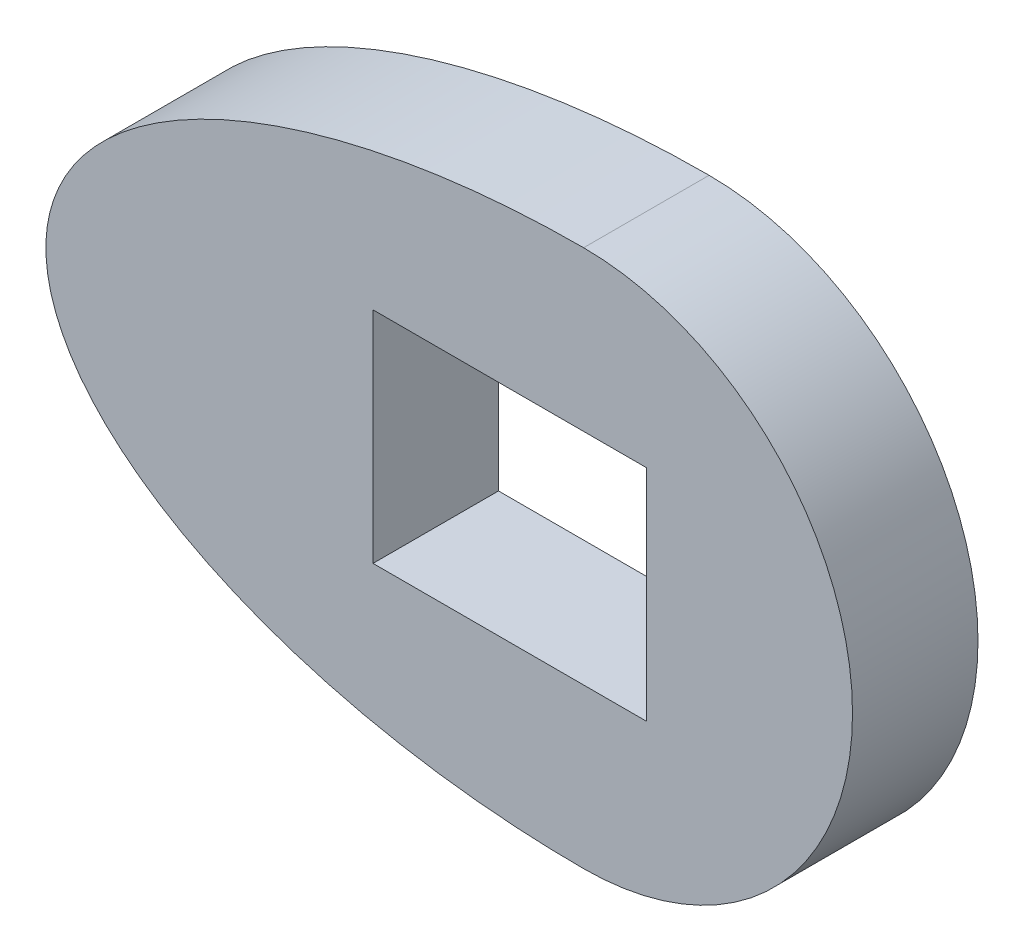
ISO-10303-21;
HEADER;
FILE_DESCRIPTION(('STEP AP214'),'2;1');
FILE_NAME('part.step','',(''),(''),'','','');
FILE_SCHEMA(('AUTOMOTIVE_DESIGN { 1 0 10303 214 1 1 1 1 }'));
ENDSEC;
DATA;
#1=APPLICATION_CONTEXT('core data for automotive mechanical design processes');
#2=APPLICATION_PROTOCOL_DEFINITION('international standard','automotive_design',2000,#1);
#3=PRODUCT_CONTEXT('',#1,'mechanical');
#4=PRODUCT('Part','Part','',(#3));
#5=PRODUCT_RELATED_PRODUCT_CATEGORY('part','',(#4));
#6=PRODUCT_DEFINITION_FORMATION('','',#4);
#7=PRODUCT_DEFINITION_CONTEXT('part definition',#1,'design');
#8=PRODUCT_DEFINITION('design','',#6,#7);
#9=PRODUCT_DEFINITION_SHAPE('','',#8);
#10=(LENGTH_UNIT() NAMED_UNIT(*) SI_UNIT(.MILLI.,.METRE.));
#11=(NAMED_UNIT(*) PLANE_ANGLE_UNIT() SI_UNIT($,.RADIAN.));
#12=(NAMED_UNIT(*) SI_UNIT($,.STERADIAN.) SOLID_ANGLE_UNIT());
#13=UNCERTAINTY_MEASURE_WITH_UNIT(LENGTH_MEASURE(1.E-05),#10,'distance_accuracy_value','');
#14=(GEOMETRIC_REPRESENTATION_CONTEXT(3) GLOBAL_UNCERTAINTY_ASSIGNED_CONTEXT((#13)) GLOBAL_UNIT_ASSIGNED_CONTEXT((#10,
#11,#12)) REPRESENTATION_CONTEXT('',''));
#15=CARTESIAN_POINT('',(0.,0.,0.));
#16=DIRECTION('',(0.,0.,1.));
#17=DIRECTION('',(1.,0.,0.));
#18=AXIS2_PLACEMENT_3D('',#15,#16,#17);
#19=CARTESIAN_POINT('',(0.,0.,14.));
#20=DIRECTION('',(0.,0.,1.));
#21=DIRECTION('',(1.,0.,0.));
#22=AXIS2_PLACEMENT_3D('',#19,#20,#21);
#23=ELLIPSE('',#22,60.,30.);
#24=DIRECTION('',(0.,0.,-1.));
#25=VECTOR('',#24,1.);
#26=SURFACE_OF_LINEAR_EXTRUSION('',#23,#25);
#27=CARTESIAN_POINT('',(0.,0.,0.));
#28=DIRECTION('',(0.,0.,1.));
#29=DIRECTION('',(1.,0.,0.));
#30=AXIS2_PLACEMENT_3D('',#27,#28,#29);
#31=ELLIPSE('',#30,60.,30.);
#32=CARTESIAN_POINT('',(0.,30.,0.));
#33=VERTEX_POINT('',#32);
#34=CARTESIAN_POINT('',(0.,-30.,0.));
#35=VERTEX_POINT('',#34);
#36=EDGE_CURVE('E122',#33,#35,#31,.T.);
#37=ORIENTED_EDGE('',*,*,#36,.T.);
#38=DIRECTION('',(0.,0.,-1.));
#39=VECTOR('',#38,1.);
#40=CARTESIAN_POINT('',(0.,-30.,14.));
#41=LINE('',#40,#39);
#42=CARTESIAN_POINT('',(0.,-30.,14.));
#43=VERTEX_POINT('',#42);
#44=EDGE_CURVE('E11',#43,#35,#41,.T.);
#45=ORIENTED_EDGE('',*,*,#44,.F.);
#46=CARTESIAN_POINT('',(0.,30.,14.));
#47=VERTEX_POINT('',#46);
#48=EDGE_CURVE('E123',#47,#43,#23,.T.);
#49=ORIENTED_EDGE('',*,*,#48,.F.);
#50=DIRECTION('',(0.,0.,-1.));
#51=VECTOR('',#50,1.);
#52=CARTESIAN_POINT('',(0.,30.,14.));
#53=LINE('',#52,#51);
#54=EDGE_CURVE('E41',#47,#33,#53,.T.);
#55=ORIENTED_EDGE('',*,*,#54,.T.);
#56=EDGE_LOOP('',(#37,#45,#49,#55));
#57=FACE_BOUND('',#56,.T.);
#58=ADVANCED_FACE('F33',(#57),#26,.F.);
#59=CARTESIAN_POINT('',(0.,0.,14.));
#60=DIRECTION('',(0.,0.,-1.));
#61=DIRECTION('',(-1.,0.,0.));
#62=AXIS2_PLACEMENT_3D('',#59,#60,#61);
#63=CYLINDRICAL_SURFACE('',#62,30.);
#64=CARTESIAN_POINT('',(0.,0.,0.));
#65=DIRECTION('',(0.,0.,1.));
#66=DIRECTION('',(1.,0.,0.));
#67=AXIS2_PLACEMENT_3D('',#64,#65,#66);
#68=CIRCLE('',#67,30.);
#69=EDGE_CURVE('E128',#35,#33,#68,.T.);
#70=ORIENTED_EDGE('',*,*,#69,.T.);
#71=ORIENTED_EDGE('',*,*,#54,.F.);
#72=CARTESIAN_POINT('',(0.,0.,14.));
#73=DIRECTION('',(0.,0.,1.));
#74=DIRECTION('',(1.,0.,0.));
#75=AXIS2_PLACEMENT_3D('',#72,#73,#74);
#76=CIRCLE('',#75,30.);
#77=EDGE_CURVE('E127',#43,#47,#76,.T.);
#78=ORIENTED_EDGE('',*,*,#77,.F.);
#79=ORIENTED_EDGE('',*,*,#44,.T.);
#80=EDGE_LOOP('',(#70,#71,#78,#79));
#81=FACE_BOUND('',#80,.T.);
#82=ADVANCED_FACE('F141',(#81),#63,.T.);
#83=CARTESIAN_POINT('',(0.,0.,14.));
#84=DIRECTION('',(0.,0.,1.));
#85=DIRECTION('',(1.,0.,0.));
#86=AXIS2_PLACEMENT_3D('',#83,#84,#85);
#87=PLANE('',#86);
#88=DIRECTION('',(-1.,0.,0.));
#89=VECTOR('',#88,1.);
#90=CARTESIAN_POINT('',(-23.5,-12.25,14.));
#91=LINE('',#90,#89);
#92=CARTESIAN_POINT('',(7.,-12.25,14.));
#93=VERTEX_POINT('',#92);
#94=CARTESIAN_POINT('',(-23.5,-12.25,14.));
#95=VERTEX_POINT('',#94);
#96=EDGE_CURVE('E100',#93,#95,#91,.T.);
#97=ORIENTED_EDGE('',*,*,#96,.T.);
#98=DIRECTION('',(0.,1.,0.));
#99=VECTOR('',#98,1.);
#100=CARTESIAN_POINT('',(-23.5,12.25,14.));
#101=LINE('',#100,#99);
#102=CARTESIAN_POINT('',(-23.5,12.25,14.));
#103=VERTEX_POINT('',#102);
#104=EDGE_CURVE('E87',#95,#103,#101,.T.);
#105=ORIENTED_EDGE('',*,*,#104,.T.);
#106=DIRECTION('',(1.,0.,0.));
#107=VECTOR('',#106,1.);
#108=CARTESIAN_POINT('',(-23.5,12.25,14.));
#109=LINE('',#108,#107);
#110=CARTESIAN_POINT('',(7.,12.25,14.));
#111=VERTEX_POINT('',#110);
#112=EDGE_CURVE('E118',#103,#111,#109,.T.);
#113=ORIENTED_EDGE('',*,*,#112,.T.);
#114=DIRECTION('',(0.,-1.,0.));
#115=VECTOR('',#114,1.);
#116=CARTESIAN_POINT('',(7.,12.25,14.));
#117=LINE('',#116,#115);
#118=EDGE_CURVE('E108',#111,#93,#117,.T.);
#119=ORIENTED_EDGE('',*,*,#118,.T.);
#120=EDGE_LOOP('',(#97,#105,#113,#119));
#121=FACE_BOUND('',#120,.T.);
#122=ORIENTED_EDGE('',*,*,#48,.T.);
#123=ORIENTED_EDGE('',*,*,#77,.T.);
#124=EDGE_LOOP('',(#122,#123));
#125=FACE_BOUND('',#124,.T.);
#126=ADVANCED_FACE('F106',(#121,#125),#87,.T.);
#127=CARTESIAN_POINT('',(0.,0.,0.));
#128=DIRECTION('',(0.,0.,1.));
#129=DIRECTION('',(1.,0.,0.));
#130=AXIS2_PLACEMENT_3D('',#127,#128,#129);
#131=PLANE('',#130);
#132=DIRECTION('',(0.,1.,0.));
#133=VECTOR('',#132,1.);
#134=CARTESIAN_POINT('',(-23.5,12.25,0.));
#135=LINE('',#134,#133);
#136=CARTESIAN_POINT('',(-23.5,-12.25,0.));
#137=VERTEX_POINT('',#136);
#138=CARTESIAN_POINT('',(-23.5,12.25,0.));
#139=VERTEX_POINT('',#138);
#140=EDGE_CURVE('E110',#137,#139,#135,.T.);
#141=ORIENTED_EDGE('',*,*,#140,.F.);
#142=DIRECTION('',(-1.,0.,0.));
#143=VECTOR('',#142,1.);
#144=CARTESIAN_POINT('',(-23.5,-12.25,0.));
#145=LINE('',#144,#143);
#146=CARTESIAN_POINT('',(7.,-12.25,0.));
#147=VERTEX_POINT('',#146);
#148=EDGE_CURVE('E103',#147,#137,#145,.T.);
#149=ORIENTED_EDGE('',*,*,#148,.F.);
#150=DIRECTION('',(0.,-1.,0.));
#151=VECTOR('',#150,1.);
#152=CARTESIAN_POINT('',(7.,12.25,0.));
#153=LINE('',#152,#151);
#154=CARTESIAN_POINT('',(7.,12.25,0.));
#155=VERTEX_POINT('',#154);
#156=EDGE_CURVE('E114',#155,#147,#153,.T.);
#157=ORIENTED_EDGE('',*,*,#156,.F.);
#158=DIRECTION('',(1.,0.,0.));
#159=VECTOR('',#158,1.);
#160=CARTESIAN_POINT('',(-23.5,12.25,0.));
#161=LINE('',#160,#159);
#162=EDGE_CURVE('E56',#139,#155,#161,.T.);
#163=ORIENTED_EDGE('',*,*,#162,.F.);
#164=EDGE_LOOP('',(#141,#149,#157,#163));
#165=FACE_BOUND('',#164,.T.);
#166=ORIENTED_EDGE('',*,*,#36,.F.);
#167=ORIENTED_EDGE('',*,*,#69,.F.);
#168=EDGE_LOOP('',(#166,#167));
#169=FACE_BOUND('',#168,.T.);
#170=ADVANCED_FACE('F140',(#165,#169),#131,.F.);
#171=CARTESIAN_POINT('',(-23.5,-12.25,53.1216052840371));
#172=DIRECTION('',(0.,-1.,0.));
#173=DIRECTION('',(1.,0.,0.));
#174=AXIS2_PLACEMENT_3D('',#171,#172,#173);
#175=PLANE('',#174);
#176=DIRECTION('',(0.,0.,-1.));
#177=VECTOR('',#176,1.);
#178=CARTESIAN_POINT('',(7.,-12.25,53.1216052840371));
#179=LINE('',#178,#177);
#180=EDGE_CURVE('E48',#93,#147,#179,.T.);
#181=ORIENTED_EDGE('',*,*,#180,.T.);
#182=ORIENTED_EDGE('',*,*,#148,.T.);
#183=DIRECTION('',(0.,0.,-1.));
#184=VECTOR('',#183,1.);
#185=CARTESIAN_POINT('',(-23.5,-12.25,53.1216052840371));
#186=LINE('',#185,#184);
#187=EDGE_CURVE('E91',#95,#137,#186,.T.);
#188=ORIENTED_EDGE('',*,*,#187,.F.);
#189=ORIENTED_EDGE('',*,*,#96,.F.);
#190=EDGE_LOOP('',(#181,#182,#188,#189));
#191=FACE_BOUND('',#190,.T.);
#192=ADVANCED_FACE('F99',(#191),#175,.F.);
#193=CARTESIAN_POINT('',(-23.5,12.25,53.1216052840371));
#194=DIRECTION('',(-1.,0.,0.));
#195=DIRECTION('',(0.,0.,1.));
#196=AXIS2_PLACEMENT_3D('',#193,#194,#195);
#197=PLANE('',#196);
#198=ORIENTED_EDGE('',*,*,#187,.T.);
#199=ORIENTED_EDGE('',*,*,#140,.T.);
#200=DIRECTION('',(0.,0.,-1.));
#201=VECTOR('',#200,1.);
#202=CARTESIAN_POINT('',(-23.5,12.25,53.1216052840371));
#203=LINE('',#202,#201);
#204=EDGE_CURVE('E93',#103,#139,#203,.T.);
#205=ORIENTED_EDGE('',*,*,#204,.F.);
#206=ORIENTED_EDGE('',*,*,#104,.F.);
#207=EDGE_LOOP('',(#198,#199,#205,#206));
#208=FACE_BOUND('',#207,.T.);
#209=ADVANCED_FACE('F89',(#208),#197,.F.);
#210=CARTESIAN_POINT('',(-23.5,12.25,53.1216052840371));
#211=DIRECTION('',(0.,1.,0.));
#212=DIRECTION('',(-1.,0.,0.));
#213=AXIS2_PLACEMENT_3D('',#210,#211,#212);
#214=PLANE('',#213);
#215=ORIENTED_EDGE('',*,*,#204,.T.);
#216=ORIENTED_EDGE('',*,*,#162,.T.);
#217=DIRECTION('',(0.,0.,-1.));
#218=VECTOR('',#217,1.);
#219=CARTESIAN_POINT('',(7.,12.25,53.1216052840371));
#220=LINE('',#219,#218);
#221=EDGE_CURVE('E117',#111,#155,#220,.T.);
#222=ORIENTED_EDGE('',*,*,#221,.F.);
#223=ORIENTED_EDGE('',*,*,#112,.F.);
#224=EDGE_LOOP('',(#215,#216,#222,#223));
#225=FACE_BOUND('',#224,.T.);
#226=ADVANCED_FACE('F184',(#225),#214,.F.);
#227=CARTESIAN_POINT('',(7.,12.25,53.1216052840371));
#228=DIRECTION('',(1.,0.,0.));
#229=DIRECTION('',(0.,1.,0.));
#230=AXIS2_PLACEMENT_3D('',#227,#228,#229);
#231=PLANE('',#230);
#232=ORIENTED_EDGE('',*,*,#221,.T.);
#233=ORIENTED_EDGE('',*,*,#156,.T.);
#234=ORIENTED_EDGE('',*,*,#180,.F.);
#235=ORIENTED_EDGE('',*,*,#118,.F.);
#236=EDGE_LOOP('',(#232,#233,#234,#235));
#237=FACE_BOUND('',#236,.T.);
#238=ADVANCED_FACE('F193',(#237),#231,.F.);
#239=CLOSED_SHELL('',(#58,#82,#126,#170,#192,#209,#226,#238));
#240=MANIFOLD_SOLID_BREP('B2',#239);
#241=ADVANCED_BREP_SHAPE_REPRESENTATION('',(#18,#240),#14);
#242=SHAPE_DEFINITION_REPRESENTATION(#9,#241);
ENDSEC;
END-ISO-10303-21;
